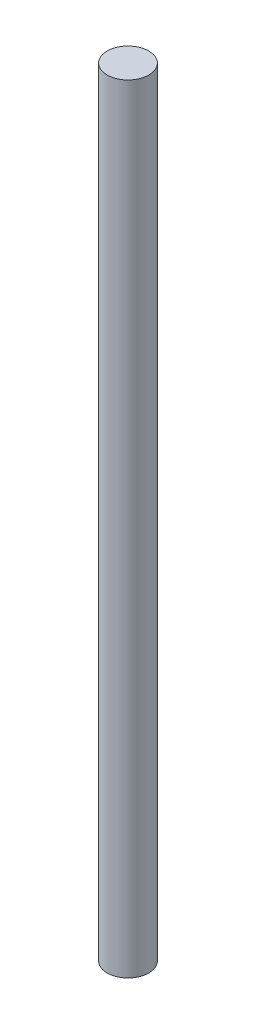
ISO-10303-21;
HEADER;
FILE_DESCRIPTION(('STEP AP214'),'2;1');
FILE_NAME('part.step','',(''),(''),'','','');
FILE_SCHEMA(('AUTOMOTIVE_DESIGN { 1 0 10303 214 1 1 1 1 }'));
ENDSEC;
DATA;
#1=APPLICATION_CONTEXT('core data for automotive mechanical design processes');
#2=APPLICATION_PROTOCOL_DEFINITION('international standard','automotive_design',2000,#1);
#3=PRODUCT_CONTEXT('',#1,'mechanical');
#4=PRODUCT('Part','Part','',(#3));
#5=PRODUCT_RELATED_PRODUCT_CATEGORY('part','',(#4));
#6=PRODUCT_DEFINITION_FORMATION('','',#4);
#7=PRODUCT_DEFINITION_CONTEXT('part definition',#1,'design');
#8=PRODUCT_DEFINITION('design','',#6,#7);
#9=PRODUCT_DEFINITION_SHAPE('','',#8);
#10=(LENGTH_UNIT() NAMED_UNIT(*) SI_UNIT(.MILLI.,.METRE.));
#11=(NAMED_UNIT(*) PLANE_ANGLE_UNIT() SI_UNIT($,.RADIAN.));
#12=(NAMED_UNIT(*) SI_UNIT($,.STERADIAN.) SOLID_ANGLE_UNIT());
#13=UNCERTAINTY_MEASURE_WITH_UNIT(LENGTH_MEASURE(1.E-05),#10,'distance_accuracy_value','');
#14=(GEOMETRIC_REPRESENTATION_CONTEXT(3) GLOBAL_UNCERTAINTY_ASSIGNED_CONTEXT((#13)) GLOBAL_UNIT_ASSIGNED_CONTEXT((#10,
#11,#12)) REPRESENTATION_CONTEXT('',''));
#15=CARTESIAN_POINT('',(0.,0.,0.));
#16=DIRECTION('',(0.,0.,1.));
#17=DIRECTION('',(1.,0.,0.));
#18=AXIS2_PLACEMENT_3D('',#15,#16,#17);
#19=CARTESIAN_POINT('',(0.,185.,0.));
#20=DIRECTION('',(0.,-1.,0.));
#21=DIRECTION('',(0.,0.,-1.));
#22=AXIS2_PLACEMENT_3D('',#19,#20,#21);
#23=CYLINDRICAL_SURFACE('',#22,4.95);
#24=CARTESIAN_POINT('',(0.,185.,0.));
#25=DIRECTION('',(0.,1.,0.));
#26=DIRECTION('',(0.,0.,1.));
#27=AXIS2_PLACEMENT_3D('',#24,#25,#26);
#28=CIRCLE('',#27,4.95);
#29=CARTESIAN_POINT('',(0.,185.,4.95));
#30=VERTEX_POINT('',#29);
#31=EDGE_CURVE('E10',#30,#30,#28,.T.);
#32=ORIENTED_EDGE('',*,*,#31,.F.);
#33=EDGE_LOOP('',(#32));
#34=FACE_BOUND('',#33,.T.);
#35=CARTESIAN_POINT('',(0.,0.,0.));
#36=DIRECTION('',(0.,1.,0.));
#37=DIRECTION('',(0.,0.,1.));
#38=AXIS2_PLACEMENT_3D('',#35,#36,#37);
#39=CIRCLE('',#38,4.95);
#40=CARTESIAN_POINT('',(0.,0.,4.95));
#41=VERTEX_POINT('',#40);
#42=EDGE_CURVE('E40',#41,#41,#39,.T.);
#43=ORIENTED_EDGE('',*,*,#42,.T.);
#44=EDGE_LOOP('',(#43));
#45=FACE_BOUND('',#44,.T.);
#46=ADVANCED_FACE('F37',(#34,#45),#23,.T.);
#47=CARTESIAN_POINT('',(0.,185.,0.));
#48=DIRECTION('',(0.,1.,0.));
#49=DIRECTION('',(0.,0.,1.));
#50=AXIS2_PLACEMENT_3D('',#47,#48,#49);
#51=PLANE('',#50);
#52=ORIENTED_EDGE('',*,*,#31,.T.);
#53=EDGE_LOOP('',(#52));
#54=FACE_BOUND('',#53,.T.);
#55=ADVANCED_FACE('F54',(#54),#51,.T.);
#56=CARTESIAN_POINT('',(0.,0.,0.));
#57=DIRECTION('',(0.,1.,0.));
#58=DIRECTION('',(0.,0.,1.));
#59=AXIS2_PLACEMENT_3D('',#56,#57,#58);
#60=PLANE('',#59);
#61=ORIENTED_EDGE('',*,*,#42,.F.);
#62=EDGE_LOOP('',(#61));
#63=FACE_BOUND('',#62,.T.);
#64=ADVANCED_FACE('F52',(#63),#60,.F.);
#65=CLOSED_SHELL('',(#46,#55,#64));
#66=MANIFOLD_SOLID_BREP('B2',#65);
#67=ADVANCED_BREP_SHAPE_REPRESENTATION('',(#18,#66),#14);
#68=SHAPE_DEFINITION_REPRESENTATION(#9,#67);
ENDSEC;
END-ISO-10303-21;
